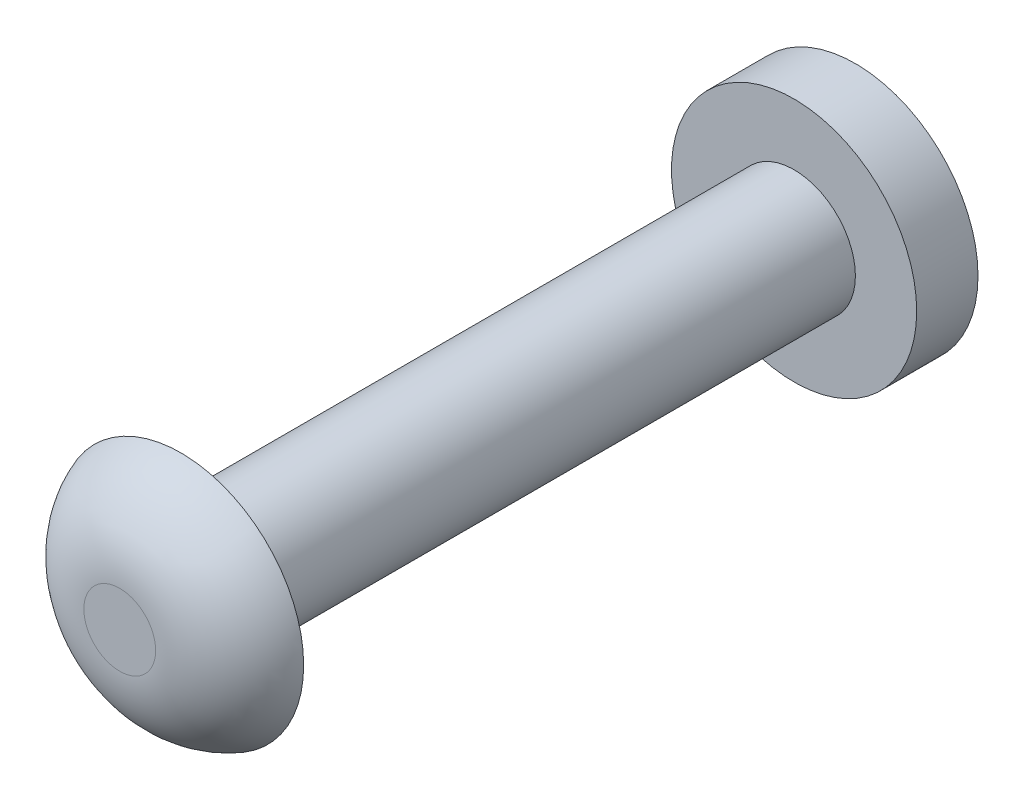
ISO-10303-21;
HEADER;
FILE_DESCRIPTION(('STEP AP214'),'2;1');
FILE_NAME('part.step','',(''),(''),'','','');
FILE_SCHEMA(('AUTOMOTIVE_DESIGN { 1 0 10303 214 1 1 1 1 }'));
ENDSEC;
DATA;
#1=APPLICATION_CONTEXT('core data for automotive mechanical design processes');
#2=APPLICATION_PROTOCOL_DEFINITION('international standard','automotive_design',2000,#1);
#3=PRODUCT_CONTEXT('',#1,'mechanical');
#4=PRODUCT('Part','Part','',(#3));
#5=PRODUCT_RELATED_PRODUCT_CATEGORY('part','',(#4));
#6=PRODUCT_DEFINITION_FORMATION('','',#4);
#7=PRODUCT_DEFINITION_CONTEXT('part definition',#1,'design');
#8=PRODUCT_DEFINITION('design','',#6,#7);
#9=PRODUCT_DEFINITION_SHAPE('','',#8);
#10=(LENGTH_UNIT() NAMED_UNIT(*) SI_UNIT(.MILLI.,.METRE.));
#11=(NAMED_UNIT(*) PLANE_ANGLE_UNIT() SI_UNIT($,.RADIAN.));
#12=(NAMED_UNIT(*) SI_UNIT($,.STERADIAN.) SOLID_ANGLE_UNIT());
#13=UNCERTAINTY_MEASURE_WITH_UNIT(LENGTH_MEASURE(1.E-05),#10,'distance_accuracy_value','');
#14=(GEOMETRIC_REPRESENTATION_CONTEXT(3) GLOBAL_UNCERTAINTY_ASSIGNED_CONTEXT((#13)) GLOBAL_UNIT_ASSIGNED_CONTEXT((#10,
#11,#12)) REPRESENTATION_CONTEXT('',''));
#15=CARTESIAN_POINT('',(0.,0.,0.));
#16=DIRECTION('',(0.,0.,1.));
#17=DIRECTION('',(1.,0.,0.));
#18=AXIS2_PLACEMENT_3D('',#15,#16,#17);
#19=CARTESIAN_POINT('',(0.,0.,25.));
#20=DIRECTION('',(0.,0.,-1.));
#21=DIRECTION('',(-1.,0.,0.));
#22=AXIS2_PLACEMENT_3D('',#19,#20,#21);
#23=CYLINDRICAL_SURFACE('',#22,5.);
#24=CARTESIAN_POINT('',(0.,0.,25.));
#25=DIRECTION('',(0.,0.,1.));
#26=DIRECTION('',(1.,0.,0.));
#27=AXIS2_PLACEMENT_3D('',#24,#25,#26);
#28=CIRCLE('',#27,5.);
#29=CARTESIAN_POINT('',(5.,0.,25.));
#30=VERTEX_POINT('',#29);
#31=EDGE_CURVE('E45',#30,#30,#28,.T.);
#32=ORIENTED_EDGE('',*,*,#31,.F.);
#33=EDGE_LOOP('',(#32));
#34=FACE_BOUND('',#33,.T.);
#35=CARTESIAN_POINT('',(0.,0.,-25.));
#36=DIRECTION('',(0.,0.,1.));
#37=DIRECTION('',(1.,0.,0.));
#38=AXIS2_PLACEMENT_3D('',#35,#36,#37);
#39=CIRCLE('',#38,5.);
#40=CARTESIAN_POINT('',(5.,0.,-25.));
#41=VERTEX_POINT('',#40);
#42=EDGE_CURVE('E56',#41,#41,#39,.T.);
#43=ORIENTED_EDGE('',*,*,#42,.T.);
#44=EDGE_LOOP('',(#43));
#45=FACE_BOUND('',#44,.T.);
#46=ADVANCED_FACE('F37',(#34,#45),#23,.T.);
#47=CARTESIAN_POINT('',(0.,0.,30.));
#48=DIRECTION('',(0.,0.,1.));
#49=DIRECTION('',(1.,0.,0.));
#50=AXIS2_PLACEMENT_3D('',#47,#48,#49);
#51=PLANE('',#50);
#52=CARTESIAN_POINT('',(0.,0.,30.));
#53=DIRECTION('',(0.,0.,1.));
#54=DIRECTION('',(1.,0.,0.));
#55=AXIS2_PLACEMENT_3D('',#52,#53,#54);
#56=CIRCLE('',#55,2.92893218813452);
#57=CARTESIAN_POINT('',(2.92893218813452,0.,30.));
#58=VERTEX_POINT('',#57);
#59=EDGE_CURVE('E10',#58,#58,#56,.T.);
#60=ORIENTED_EDGE('',*,*,#59,.T.);
#61=EDGE_LOOP('',(#60));
#62=FACE_BOUND('',#61,.T.);
#63=ADVANCED_FACE('F87',(#62),#51,.T.);
#64=CARTESIAN_POINT('',(0.,0.,25.));
#65=DIRECTION('',(0.,0.,1.));
#66=DIRECTION('',(1.,0.,0.));
#67=AXIS2_PLACEMENT_3D('',#64,#65,#66);
#68=PLANE('',#67);
#69=ORIENTED_EDGE('',*,*,#31,.T.);
#70=EDGE_LOOP('',(#69));
#71=FACE_BOUND('',#70,.T.);
#72=CARTESIAN_POINT('',(0.,0.,25.));
#73=DIRECTION('',(0.,0.,1.));
#74=DIRECTION('',(1.,0.,0.));
#75=AXIS2_PLACEMENT_3D('',#72,#73,#74);
#76=CIRCLE('',#75,10.);
#77=CARTESIAN_POINT('',(10.,0.,25.));
#78=VERTEX_POINT('',#77);
#79=EDGE_CURVE('E50',#78,#78,#76,.T.);
#80=ORIENTED_EDGE('',*,*,#79,.F.);
#81=EDGE_LOOP('',(#80));
#82=FACE_BOUND('',#81,.T.);
#83=ADVANCED_FACE('F79',(#71,#82),#68,.F.);
#84=CARTESIAN_POINT('',(0.,0.,-30.));
#85=DIRECTION('',(0.,0.,1.));
#86=DIRECTION('',(1.,0.,0.));
#87=AXIS2_PLACEMENT_3D('',#84,#85,#86);
#88=CYLINDRICAL_SURFACE('',#87,10.);
#89=CARTESIAN_POINT('',(0.,0.,-30.));
#90=DIRECTION('',(0.,0.,1.));
#91=DIRECTION('',(1.,0.,0.));
#92=AXIS2_PLACEMENT_3D('',#89,#90,#91);
#93=CIRCLE('',#92,10.);
#94=CARTESIAN_POINT('',(10.,0.,-30.));
#95=VERTEX_POINT('',#94);
#96=EDGE_CURVE('E61',#95,#95,#93,.T.);
#97=ORIENTED_EDGE('',*,*,#96,.T.);
#98=EDGE_LOOP('',(#97));
#99=FACE_BOUND('',#98,.T.);
#100=CARTESIAN_POINT('',(0.,0.,-25.));
#101=DIRECTION('',(0.,0.,1.));
#102=DIRECTION('',(1.,0.,0.));
#103=AXIS2_PLACEMENT_3D('',#100,#101,#102);
#104=CIRCLE('',#103,10.);
#105=CARTESIAN_POINT('',(10.,0.,-25.));
#106=VERTEX_POINT('',#105);
#107=EDGE_CURVE('E66',#106,#106,#104,.T.);
#108=ORIENTED_EDGE('',*,*,#107,.F.);
#109=EDGE_LOOP('',(#108));
#110=FACE_BOUND('',#109,.T.);
#111=ADVANCED_FACE('F76',(#99,#110),#88,.T.);
#112=CARTESIAN_POINT('',(0.,0.,-30.));
#113=DIRECTION('',(0.,0.,-1.));
#114=DIRECTION('',(1.,0.,0.));
#115=AXIS2_PLACEMENT_3D('',#112,#113,#114);
#116=PLANE('',#115);
#117=ORIENTED_EDGE('',*,*,#96,.F.);
#118=EDGE_LOOP('',(#117));
#119=FACE_BOUND('',#118,.T.);
#120=ADVANCED_FACE('F78',(#119),#116,.T.);
#121=CARTESIAN_POINT('',(0.,0.,-25.));
#122=DIRECTION('',(0.,0.,-1.));
#123=DIRECTION('',(1.,0.,0.));
#124=AXIS2_PLACEMENT_3D('',#121,#122,#123);
#125=PLANE('',#124);
#126=ORIENTED_EDGE('',*,*,#42,.F.);
#127=EDGE_LOOP('',(#126));
#128=FACE_BOUND('',#127,.T.);
#129=ORIENTED_EDGE('',*,*,#107,.T.);
#130=EDGE_LOOP('',(#129));
#131=FACE_BOUND('',#130,.T.);
#132=ADVANCED_FACE('F74',(#128,#131),#125,.F.);
#133=CARTESIAN_POINT('',(0.,0.,22.5));
#134=DIRECTION('',(0.,0.,-1.));
#135=DIRECTION('',(-1.,0.,0.));
#136=AXIS2_PLACEMENT_3D('',#133,#134,#135);
#137=DEGENERATE_TOROIDAL_SURFACE('',#136,2.92893218813452,7.5,.T.);
#138=ORIENTED_EDGE('',*,*,#79,.T.);
#139=EDGE_LOOP('',(#138));
#140=FACE_BOUND('',#139,.T.);
#141=ORIENTED_EDGE('',*,*,#59,.F.);
#142=EDGE_LOOP('',(#141));
#143=FACE_BOUND('',#142,.T.);
#144=ADVANCED_FACE('F39',(#140,#143),#137,.T.);
#145=CLOSED_SHELL('',(#46,#63,#83,#111,#120,#132,#144));
#146=MANIFOLD_SOLID_BREP('B2',#145);
#147=ADVANCED_BREP_SHAPE_REPRESENTATION('',(#18,#146),#14);
#148=SHAPE_DEFINITION_REPRESENTATION(#9,#147);
ENDSEC;
END-ISO-10303-21;
